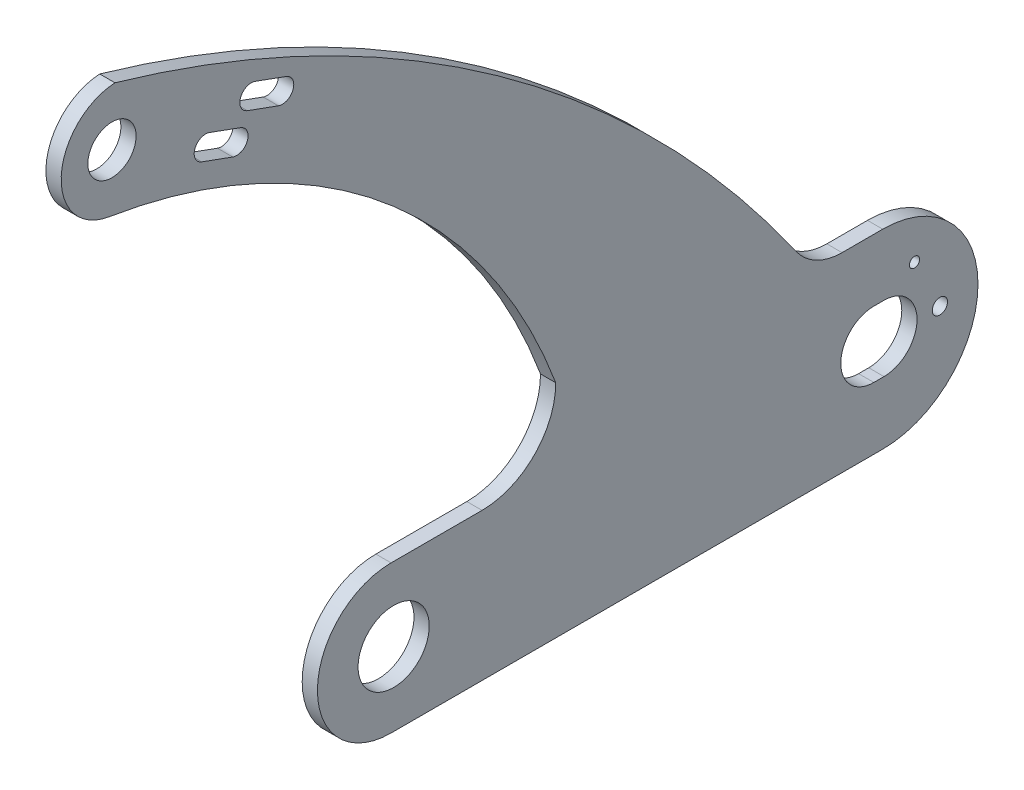
ISO-10303-21;
HEADER;
FILE_DESCRIPTION(('STEP AP214'),'2;1');
FILE_NAME('part.step','',(''),(''),'','','');
FILE_SCHEMA(('AUTOMOTIVE_DESIGN { 1 0 10303 214 1 1 1 1 }'));
ENDSEC;
DATA;
#1=APPLICATION_CONTEXT('core data for automotive mechanical design processes');
#2=APPLICATION_PROTOCOL_DEFINITION('international standard','automotive_design',2000,#1);
#3=PRODUCT_CONTEXT('',#1,'mechanical');
#4=PRODUCT('Part','Part','',(#3));
#5=PRODUCT_RELATED_PRODUCT_CATEGORY('part','',(#4));
#6=PRODUCT_DEFINITION_FORMATION('','',#4);
#7=PRODUCT_DEFINITION_CONTEXT('part definition',#1,'design');
#8=PRODUCT_DEFINITION('design','',#6,#7);
#9=PRODUCT_DEFINITION_SHAPE('','',#8);
#10=(LENGTH_UNIT() NAMED_UNIT(*) SI_UNIT(.MILLI.,.METRE.));
#11=(NAMED_UNIT(*) PLANE_ANGLE_UNIT() SI_UNIT($,.RADIAN.));
#12=(NAMED_UNIT(*) SI_UNIT($,.STERADIAN.) SOLID_ANGLE_UNIT());
#13=UNCERTAINTY_MEASURE_WITH_UNIT(LENGTH_MEASURE(1.E-05),#10,'distance_accuracy_value','');
#14=(GEOMETRIC_REPRESENTATION_CONTEXT(3) GLOBAL_UNCERTAINTY_ASSIGNED_CONTEXT((#13)) GLOBAL_UNIT_ASSIGNED_CONTEXT((#10,
#11,#12)) REPRESENTATION_CONTEXT('',''));
#15=CARTESIAN_POINT('',(0.,0.,0.));
#16=DIRECTION('',(0.,0.,1.));
#17=DIRECTION('',(1.,0.,0.));
#18=AXIS2_PLACEMENT_3D('',#15,#16,#17);
#19=CARTESIAN_POINT('',(3.,14.5,48.375));
#20=DIRECTION('',(-1.,0.,0.));
#21=DIRECTION('',(0.,0.,1.));
#22=AXIS2_PLACEMENT_3D('',#19,#20,#21);
#23=PLANE('',#22);
#24=CARTESIAN_POINT('',(3.,122.32435215854,75.8898695568463));
#25=DIRECTION('',(1.,0.,0.));
#26=DIRECTION('',(0.,0.,-1.));
#27=AXIS2_PLACEMENT_3D('',#24,#25,#26);
#28=CIRCLE('',#27,2.24999999999995);
#29=CARTESIAN_POINT('',(3.,124.438660555309,75.1203242343635));
#30=VERTEX_POINT('',#29);
#31=CARTESIAN_POINT('',(3.,120.210043761772,76.6594148793291));
#32=VERTEX_POINT('',#31);
#33=EDGE_CURVE('E240',#30,#32,#28,.T.);
#34=ORIENTED_EDGE('',*,*,#33,.F.);
#35=DIRECTION('',(0.,0.34202014332567,0.939692620785908));
#36=VECTOR('',#35,1.);
#37=CARTESIAN_POINT('',(3.,124.438660555309,75.1203242343635));
#38=LINE('',#37,#36);
#39=CARTESIAN_POINT('',(3.,122.215529623692,69.0123221992552));
#40=VERTEX_POINT('',#39);
#41=EDGE_CURVE('E251',#40,#30,#38,.T.);
#42=ORIENTED_EDGE('',*,*,#41,.F.);
#43=CARTESIAN_POINT('',(3.,120.101221226923,69.7818675217379));
#44=DIRECTION('',(1.,0.,0.));
#45=DIRECTION('',(0.,0.,-1.));
#46=AXIS2_PLACEMENT_3D('',#43,#44,#45);
#47=CIRCLE('',#46,2.24999999999998);
#48=CARTESIAN_POINT('',(3.,117.986912830155,70.5514128442207));
#49=VERTEX_POINT('',#48);
#50=EDGE_CURVE('E247',#49,#40,#47,.T.);
#51=ORIENTED_EDGE('',*,*,#50,.F.);
#52=DIRECTION('',(0.,-0.342020143325676,-0.939692620785906));
#53=VECTOR('',#52,1.);
#54=CARTESIAN_POINT('',(3.,120.210043761772,76.6594148793291));
#55=LINE('',#54,#53);
#56=EDGE_CURVE('E243',#32,#49,#55,.T.);
#57=ORIENTED_EDGE('',*,*,#56,.F.);
#58=EDGE_LOOP('',(#34,#42,#51,#57));
#59=FACE_BOUND('',#58,.T.);
#60=CARTESIAN_POINT('',(3.,126.865280687486,103.305641058254));
#61=DIRECTION('',(1.,0.,0.));
#62=DIRECTION('',(0.,0.,-1.));
#63=AXIS2_PLACEMENT_3D('',#60,#61,#62);
#64=CIRCLE('',#63,4.75000000000001);
#65=CARTESIAN_POINT('',(3.,126.865280687486,98.5556410582536));
#66=VERTEX_POINT('',#65);
#67=EDGE_CURVE('E326',#66,#66,#64,.T.);
#68=ORIENTED_EDGE('',*,*,#67,.F.);
#69=EDGE_LOOP('',(#68));
#70=FACE_BOUND('',#69,.T.);
#71=CARTESIAN_POINT('',(3.,14.5,47.875));
#72=DIRECTION('',(1.,0.,0.));
#73=DIRECTION('',(0.,0.,-1.));
#74=AXIS2_PLACEMENT_3D('',#71,#72,#73);
#75=CIRCLE('',#74,7.);
#76=CARTESIAN_POINT('',(3.,14.5,40.875));
#77=VERTEX_POINT('',#76);
#78=EDGE_CURVE('E334',#77,#77,#75,.T.);
#79=ORIENTED_EDGE('',*,*,#78,.F.);
#80=EDGE_LOOP('',(#79));
#81=FACE_BOUND('',#80,.T.);
#82=CARTESIAN_POINT('',(3.,28.75,-54.625));
#83=DIRECTION('',(1.,0.,0.));
#84=DIRECTION('',(0.,0.,-1.));
#85=AXIS2_PLACEMENT_3D('',#82,#83,#84);
#86=CIRCLE('',#85,0.999999999999998);
#87=CARTESIAN_POINT('',(3.,28.75,-55.625));
#88=VERTEX_POINT('',#87);
#89=EDGE_CURVE('E342',#88,#88,#86,.T.);
#90=ORIENTED_EDGE('',*,*,#89,.F.);
#91=EDGE_LOOP('',(#90));
#92=FACE_BOUND('',#91,.T.);
#93=CARTESIAN_POINT('',(3.,18.75,-59.625));
#94=DIRECTION('',(1.,0.,0.));
#95=DIRECTION('',(0.,0.,-1.));
#96=AXIS2_PLACEMENT_3D('',#93,#94,#95);
#97=CIRCLE('',#96,1.5);
#98=CARTESIAN_POINT('',(3.,18.75,-61.125));
#99=VERTEX_POINT('',#98);
#100=EDGE_CURVE('E350',#99,#99,#97,.T.);
#101=ORIENTED_EDGE('',*,*,#100,.F.);
#102=EDGE_LOOP('',(#101));
#103=FACE_BOUND('',#102,.T.);
#104=CARTESIAN_POINT('',(3.,14.5,48.375));
#105=DIRECTION('',(1.,0.,0.));
#106=DIRECTION('',(0.,0.,1.));
#107=AXIS2_PLACEMENT_3D('',#104,#105,#106);
#108=CIRCLE('',#107,14.5);
#109=CARTESIAN_POINT('',(3.,29.,48.375));
#110=VERTEX_POINT('',#109);
#111=CARTESIAN_POINT('',(3.,0.,48.375));
#112=VERTEX_POINT('',#111);
#113=EDGE_CURVE('E358',#110,#112,#108,.T.);
#114=ORIENTED_EDGE('',*,*,#113,.T.);
#115=DIRECTION('',(0.,0.,-1.));
#116=VECTOR('',#115,1.);
#117=CARTESIAN_POINT('',(3.,0.,48.375));
#118=LINE('',#117,#116);
#119=CARTESIAN_POINT('',(3.,0.,-48.375));
#120=VERTEX_POINT('',#119);
#121=EDGE_CURVE('E362',#112,#120,#118,.T.);
#122=ORIENTED_EDGE('',*,*,#121,.T.);
#123=CARTESIAN_POINT('',(3.,18.75,-48.375));
#124=DIRECTION('',(1.,0.,0.));
#125=DIRECTION('',(0.,0.,1.));
#126=AXIS2_PLACEMENT_3D('',#123,#124,#125);
#127=CIRCLE('',#126,18.75);
#128=CARTESIAN_POINT('',(3.,37.5,-48.375));
#129=VERTEX_POINT('',#128);
#130=EDGE_CURVE('E366',#120,#129,#127,.T.);
#131=ORIENTED_EDGE('',*,*,#130,.T.);
#132=DIRECTION('',(0.,0.,1.));
#133=VECTOR('',#132,1.);
#134=CARTESIAN_POINT('',(3.,37.5,-48.375));
#135=LINE('',#134,#133);
#136=CARTESIAN_POINT('',(3.,37.5,-40.375));
#137=VERTEX_POINT('',#136);
#138=EDGE_CURVE('E369',#129,#137,#135,.T.);
#139=ORIENTED_EDGE('',*,*,#138,.T.);
#140=CARTESIAN_POINT('',(3.,48.5,-40.375));
#141=DIRECTION('',(-1.,0.,0.));
#142=DIRECTION('',(0.,0.,1.));
#143=AXIS2_PLACEMENT_3D('',#140,#141,#142);
#144=CIRCLE('',#143,11.);
#145=CARTESIAN_POINT('',(3.,42.1906592001385,-31.3643275128211));
#146=VERTEX_POINT('',#145);
#147=EDGE_CURVE('E372',#137,#146,#144,.T.);
#148=ORIENTED_EDGE('',*,*,#147,.T.);
#149=CARTESIAN_POINT('',(3.,-99.7246797185502,171.311780890037));
#150=DIRECTION('',(1.,0.,0.));
#151=DIRECTION('',(0.,0.,-1.));
#152=AXIS2_PLACEMENT_3D('',#149,#150,#151);
#153=CIRCLE('',#152,247.42184288727);
#154=CARTESIAN_POINT('',(3.,138.,102.722095146145));
#155=VERTEX_POINT('',#154);
#156=EDGE_CURVE('E375',#146,#155,#153,.T.);
#157=ORIENTED_EDGE('',*,*,#156,.T.);
#158=CARTESIAN_POINT('',(3.,126.8016336227,102.091182715297));
#159=DIRECTION('',(1.,0.,0.));
#160=DIRECTION('',(0.,0.,-1.));
#161=AXIS2_PLACEMENT_3D('',#158,#159,#160);
#162=CIRCLE('',#161,11.2161250000004);
#163=CARTESIAN_POINT('',(3.,115.730561374973,103.889186970363));
#164=VERTEX_POINT('',#163);
#165=EDGE_CURVE('E378',#155,#164,#162,.T.);
#166=ORIENTED_EDGE('',*,*,#165,.T.);
#167=CARTESIAN_POINT('',(3.,4.03485944329796,122.029195711299));
#168=DIRECTION('',(-1.,0.,0.));
#169=DIRECTION('',(0.,0.,1.));
#170=AXIS2_PLACEMENT_3D('',#167,#168,#169);
#171=CIRCLE('',#170,113.159134616393);
#172=CARTESIAN_POINT('',(3.,43.5,15.975));
#173=VERTEX_POINT('',#172);
#174=EDGE_CURVE('E381',#164,#173,#171,.T.);
#175=ORIENTED_EDGE('',*,*,#174,.T.);
#176=CARTESIAN_POINT('',(3.,43.5,30.475));
#177=DIRECTION('',(-1.,0.,0.));
#178=DIRECTION('',(0.,0.,1.));
#179=AXIS2_PLACEMENT_3D('',#176,#177,#178);
#180=CIRCLE('',#179,14.5);
#181=CARTESIAN_POINT('',(3.,29.,30.475));
#182=VERTEX_POINT('',#181);
#183=EDGE_CURVE('E384',#173,#182,#180,.T.);
#184=ORIENTED_EDGE('',*,*,#183,.T.);
#185=DIRECTION('',(0.,0.,1.));
#186=VECTOR('',#185,1.);
#187=CARTESIAN_POINT('',(3.,29.,48.375));
#188=LINE('',#187,#186);
#189=EDGE_CURVE('E387',#182,#110,#188,.T.);
#190=ORIENTED_EDGE('',*,*,#189,.T.);
#191=EDGE_LOOP('',(#114,#122,#131,#139,#148,#157,#166,#175,#184,#190));
#192=FACE_BOUND('',#191,.T.);
#193=CARTESIAN_POINT('',(3.,118.095735365004,84.8817253112062));
#194=DIRECTION('',(1.,0.,0.));
#195=DIRECTION('',(0.,0.,-1.));
#196=AXIS2_PLACEMENT_3D('',#193,#194,#195);
#197=CIRCLE('',#196,2.25000000000001);
#198=CARTESIAN_POINT('',(3.,120.210043761772,84.1121799887234));
#199=VERTEX_POINT('',#198);
#200=CARTESIAN_POINT('',(3.,115.981426968236,85.6512706336889));
#201=VERTEX_POINT('',#200);
#202=EDGE_CURVE('E283',#199,#201,#197,.T.);
#203=ORIENTED_EDGE('',*,*,#202,.F.);
#204=DIRECTION('',(0.,0.342020143325671,0.939692620785908));
#205=VECTOR('',#204,1.);
#206=CARTESIAN_POINT('',(3.,120.210043761772,84.1121799887234));
#207=LINE('',#206,#205);
#208=CARTESIAN_POINT('',(3.,117.986912830155,78.0041779536146));
#209=VERTEX_POINT('',#208);
#210=EDGE_CURVE('E294',#209,#199,#207,.T.);
#211=ORIENTED_EDGE('',*,*,#210,.F.);
#212=CARTESIAN_POINT('',(3.,115.872604433387,78.7737232760973));
#213=DIRECTION('',(1.,0.,0.));
#214=DIRECTION('',(0.,0.,-1.));
#215=AXIS2_PLACEMENT_3D('',#212,#213,#214);
#216=CIRCLE('',#215,2.25000000000001);
#217=CARTESIAN_POINT('',(3.,113.758296036619,79.5432685985799));
#218=VERTEX_POINT('',#217);
#219=EDGE_CURVE('E290',#218,#209,#216,.T.);
#220=ORIENTED_EDGE('',*,*,#219,.F.);
#221=DIRECTION('',(0.,-0.342020143325671,-0.939692620785908));
#222=VECTOR('',#221,1.);
#223=CARTESIAN_POINT('',(3.,115.981426968236,85.6512706336889));
#224=LINE('',#223,#222);
#225=EDGE_CURVE('E286',#201,#218,#224,.T.);
#226=ORIENTED_EDGE('',*,*,#225,.F.);
#227=EDGE_LOOP('',(#203,#211,#220,#226));
#228=FACE_BOUND('',#227,.T.);
#229=CARTESIAN_POINT('',(3.,18.75,-46.625));
#230=DIRECTION('',(1.,0.,0.));
#231=DIRECTION('',(0.,0.,-1.));
#232=AXIS2_PLACEMENT_3D('',#229,#230,#231);
#233=CIRCLE('',#232,6.5);
#234=CARTESIAN_POINT('',(3.,25.25,-46.625));
#235=VERTEX_POINT('',#234);
#236=CARTESIAN_POINT('',(3.,12.25,-46.625));
#237=VERTEX_POINT('',#236);
#238=EDGE_CURVE('E192',#235,#237,#233,.T.);
#239=ORIENTED_EDGE('',*,*,#238,.F.);
#240=DIRECTION('',(0.,0.,1.));
#241=VECTOR('',#240,1.);
#242=CARTESIAN_POINT('',(3.,25.25,-46.625));
#243=LINE('',#242,#241);
#244=CARTESIAN_POINT('',(3.,25.25,-48.625));
#245=VERTEX_POINT('',#244);
#246=EDGE_CURVE('E218',#245,#235,#243,.T.);
#247=ORIENTED_EDGE('',*,*,#246,.F.);
#248=CARTESIAN_POINT('',(3.,18.75,-48.625));
#249=DIRECTION('',(1.,0.,0.));
#250=DIRECTION('',(0.,0.,-1.));
#251=AXIS2_PLACEMENT_3D('',#248,#249,#250);
#252=CIRCLE('',#251,6.5);
#253=CARTESIAN_POINT('',(3.,12.25,-48.625));
#254=VERTEX_POINT('',#253);
#255=EDGE_CURVE('E214',#254,#245,#252,.T.);
#256=ORIENTED_EDGE('',*,*,#255,.F.);
#257=DIRECTION('',(0.,0.,-1.));
#258=VECTOR('',#257,1.);
#259=CARTESIAN_POINT('',(3.,12.25,-46.625));
#260=LINE('',#259,#258);
#261=EDGE_CURVE('E201',#237,#254,#260,.T.);
#262=ORIENTED_EDGE('',*,*,#261,.F.);
#263=EDGE_LOOP('',(#239,#247,#256,#262));
#264=FACE_BOUND('',#263,.T.);
#265=ADVANCED_FACE('F42',(#59,#70,#81,#92,#103,#192,#228,#264),#23,.F.);
#266=CARTESIAN_POINT('',(0.,14.5,48.375));
#267=DIRECTION('',(-1.,0.,0.));
#268=DIRECTION('',(0.,0.,1.));
#269=AXIS2_PLACEMENT_3D('',#266,#267,#268);
#270=PLANE('',#269);
#271=CARTESIAN_POINT('',(0.,14.5,47.875));
#272=DIRECTION('',(1.,0.,0.));
#273=DIRECTION('',(0.,0.,-1.));
#274=AXIS2_PLACEMENT_3D('',#271,#272,#273);
#275=CIRCLE('',#274,7.);
#276=CARTESIAN_POINT('',(0.,14.5,40.875));
#277=VERTEX_POINT('',#276);
#278=EDGE_CURVE('E330',#277,#277,#275,.T.);
#279=ORIENTED_EDGE('',*,*,#278,.T.);
#280=EDGE_LOOP('',(#279));
#281=FACE_BOUND('',#280,.T.);
#282=CARTESIAN_POINT('',(0.,18.75,-59.625));
#283=DIRECTION('',(1.,0.,0.));
#284=DIRECTION('',(0.,0.,-1.));
#285=AXIS2_PLACEMENT_3D('',#282,#283,#284);
#286=CIRCLE('',#285,1.5);
#287=CARTESIAN_POINT('',(0.,18.75,-61.125));
#288=VERTEX_POINT('',#287);
#289=EDGE_CURVE('E346',#288,#288,#286,.T.);
#290=ORIENTED_EDGE('',*,*,#289,.T.);
#291=EDGE_LOOP('',(#290));
#292=FACE_BOUND('',#291,.T.);
#293=CARTESIAN_POINT('',(0.,14.5,48.375));
#294=DIRECTION('',(1.,0.,0.));
#295=DIRECTION('',(0.,0.,1.));
#296=AXIS2_PLACEMENT_3D('',#293,#294,#295);
#297=CIRCLE('',#296,14.5);
#298=CARTESIAN_POINT('',(0.,29.,48.375));
#299=VERTEX_POINT('',#298);
#300=CARTESIAN_POINT('',(0.,0.,48.375));
#301=VERTEX_POINT('',#300);
#302=EDGE_CURVE('E354',#299,#301,#297,.T.);
#303=ORIENTED_EDGE('',*,*,#302,.F.);
#304=DIRECTION('',(0.,0.,1.));
#305=VECTOR('',#304,1.);
#306=CARTESIAN_POINT('',(0.,29.,48.375));
#307=LINE('',#306,#305);
#308=CARTESIAN_POINT('',(0.,29.,30.475));
#309=VERTEX_POINT('',#308);
#310=EDGE_CURVE('E363',#309,#299,#307,.T.);
#311=ORIENTED_EDGE('',*,*,#310,.F.);
#312=CARTESIAN_POINT('',(0.,43.5,30.475));
#313=DIRECTION('',(-1.,0.,0.));
#314=DIRECTION('',(0.,0.,1.));
#315=AXIS2_PLACEMENT_3D('',#312,#313,#314);
#316=CIRCLE('',#315,14.5);
#317=CARTESIAN_POINT('',(0.,43.5,15.975));
#318=VERTEX_POINT('',#317);
#319=EDGE_CURVE('E415',#318,#309,#316,.T.);
#320=ORIENTED_EDGE('',*,*,#319,.F.);
#321=CARTESIAN_POINT('',(0.,4.03485944329796,122.029195711299));
#322=DIRECTION('',(-1.,0.,0.));
#323=DIRECTION('',(0.,0.,1.));
#324=AXIS2_PLACEMENT_3D('',#321,#322,#323);
#325=CIRCLE('',#324,113.159134616393);
#326=CARTESIAN_POINT('',(0.,115.730561374973,103.889186970363));
#327=VERTEX_POINT('',#326);
#328=EDGE_CURVE('E412',#327,#318,#325,.T.);
#329=ORIENTED_EDGE('',*,*,#328,.F.);
#330=CARTESIAN_POINT('',(0.,126.8016336227,102.091182715297));
#331=DIRECTION('',(1.,0.,0.));
#332=DIRECTION('',(0.,0.,-1.));
#333=AXIS2_PLACEMENT_3D('',#330,#331,#332);
#334=CIRCLE('',#333,11.2161250000004);
#335=CARTESIAN_POINT('',(0.,138.,102.722095146145));
#336=VERTEX_POINT('',#335);
#337=EDGE_CURVE('E409',#336,#327,#334,.T.);
#338=ORIENTED_EDGE('',*,*,#337,.F.);
#339=CARTESIAN_POINT('',(0.,-99.7246797185502,171.311780890037));
#340=DIRECTION('',(1.,0.,0.));
#341=DIRECTION('',(0.,0.,-1.));
#342=AXIS2_PLACEMENT_3D('',#339,#340,#341);
#343=CIRCLE('',#342,247.42184288727);
#344=CARTESIAN_POINT('',(0.,42.1906592001385,-31.3643275128211));
#345=VERTEX_POINT('',#344);
#346=EDGE_CURVE('E406',#345,#336,#343,.T.);
#347=ORIENTED_EDGE('',*,*,#346,.F.);
#348=CARTESIAN_POINT('',(0.,48.5,-40.375));
#349=DIRECTION('',(-1.,0.,0.));
#350=DIRECTION('',(0.,0.,1.));
#351=AXIS2_PLACEMENT_3D('',#348,#349,#350);
#352=CIRCLE('',#351,11.);
#353=CARTESIAN_POINT('',(0.,37.5,-40.375));
#354=VERTEX_POINT('',#353);
#355=EDGE_CURVE('E403',#354,#345,#352,.T.);
#356=ORIENTED_EDGE('',*,*,#355,.F.);
#357=DIRECTION('',(0.,0.,1.));
#358=VECTOR('',#357,1.);
#359=CARTESIAN_POINT('',(0.,37.5,-48.375));
#360=LINE('',#359,#358);
#361=CARTESIAN_POINT('',(0.,37.5,-48.375));
#362=VERTEX_POINT('',#361);
#363=EDGE_CURVE('E400',#362,#354,#360,.T.);
#364=ORIENTED_EDGE('',*,*,#363,.F.);
#365=CARTESIAN_POINT('',(0.,18.75,-48.375));
#366=DIRECTION('',(1.,0.,0.));
#367=DIRECTION('',(0.,0.,1.));
#368=AXIS2_PLACEMENT_3D('',#365,#366,#367);
#369=CIRCLE('',#368,18.75);
#370=CARTESIAN_POINT('',(0.,0.,-48.375));
#371=VERTEX_POINT('',#370);
#372=EDGE_CURVE('E397',#371,#362,#369,.T.);
#373=ORIENTED_EDGE('',*,*,#372,.F.);
#374=DIRECTION('',(0.,0.,-1.));
#375=VECTOR('',#374,1.);
#376=CARTESIAN_POINT('',(0.,0.,48.375));
#377=LINE('',#376,#375);
#378=EDGE_CURVE('E394',#301,#371,#377,.T.);
#379=ORIENTED_EDGE('',*,*,#378,.F.);
#380=EDGE_LOOP('',(#303,#311,#320,#329,#338,#347,#356,#364,#373,#379));
#381=FACE_BOUND('',#380,.T.);
#382=CARTESIAN_POINT('',(0.,28.75,-54.625));
#383=DIRECTION('',(1.,0.,0.));
#384=DIRECTION('',(0.,0.,-1.));
#385=AXIS2_PLACEMENT_3D('',#382,#383,#384);
#386=CIRCLE('',#385,0.999999999999998);
#387=CARTESIAN_POINT('',(0.,28.75,-55.625));
#388=VERTEX_POINT('',#387);
#389=EDGE_CURVE('E338',#388,#388,#386,.T.);
#390=ORIENTED_EDGE('',*,*,#389,.T.);
#391=EDGE_LOOP('',(#390));
#392=FACE_BOUND('',#391,.T.);
#393=CARTESIAN_POINT('',(0.,126.865280687486,103.305641058254));
#394=DIRECTION('',(1.,0.,0.));
#395=DIRECTION('',(0.,0.,-1.));
#396=AXIS2_PLACEMENT_3D('',#393,#394,#395);
#397=CIRCLE('',#396,4.75000000000001);
#398=CARTESIAN_POINT('',(0.,126.865280687486,98.5556410582536));
#399=VERTEX_POINT('',#398);
#400=EDGE_CURVE('E325',#399,#399,#397,.T.);
#401=ORIENTED_EDGE('',*,*,#400,.T.);
#402=EDGE_LOOP('',(#401));
#403=FACE_BOUND('',#402,.T.);
#404=DIRECTION('',(0.,0.342020143325671,0.939692620785908));
#405=VECTOR('',#404,1.);
#406=CARTESIAN_POINT('',(0.,120.210043761772,84.1121799887234));
#407=LINE('',#406,#405);
#408=CARTESIAN_POINT('',(0.,117.986912830155,78.0041779536146));
#409=VERTEX_POINT('',#408);
#410=CARTESIAN_POINT('',(0.,120.210043761772,84.1121799887234));
#411=VERTEX_POINT('',#410);
#412=EDGE_CURVE('E287',#409,#411,#407,.T.);
#413=ORIENTED_EDGE('',*,*,#412,.T.);
#414=CARTESIAN_POINT('',(0.,118.095735365004,84.8817253112062));
#415=DIRECTION('',(1.,0.,0.));
#416=DIRECTION('',(0.,0.,-1.));
#417=AXIS2_PLACEMENT_3D('',#414,#415,#416);
#418=CIRCLE('',#417,2.25000000000001);
#419=CARTESIAN_POINT('',(0.,115.981426968236,85.6512706336889));
#420=VERTEX_POINT('',#419);
#421=EDGE_CURVE('E282',#411,#420,#418,.T.);
#422=ORIENTED_EDGE('',*,*,#421,.T.);
#423=DIRECTION('',(0.,-0.342020143325671,-0.939692620785908));
#424=VECTOR('',#423,1.);
#425=CARTESIAN_POINT('',(0.,115.981426968236,85.6512706336889));
#426=LINE('',#425,#424);
#427=CARTESIAN_POINT('',(0.,113.758296036619,79.5432685985799));
#428=VERTEX_POINT('',#427);
#429=EDGE_CURVE('E301',#420,#428,#426,.T.);
#430=ORIENTED_EDGE('',*,*,#429,.T.);
#431=CARTESIAN_POINT('',(0.,115.872604433387,78.7737232760973));
#432=DIRECTION('',(1.,0.,0.));
#433=DIRECTION('',(0.,0.,-1.));
#434=AXIS2_PLACEMENT_3D('',#431,#432,#433);
#435=CIRCLE('',#434,2.25000000000001);
#436=EDGE_CURVE('E305',#428,#409,#435,.T.);
#437=ORIENTED_EDGE('',*,*,#436,.T.);
#438=EDGE_LOOP('',(#413,#422,#430,#437));
#439=FACE_BOUND('',#438,.T.);
#440=DIRECTION('',(0.,0.34202014332567,0.939692620785908));
#441=VECTOR('',#440,1.);
#442=CARTESIAN_POINT('',(0.,124.438660555309,75.1203242343635));
#443=LINE('',#442,#441);
#444=CARTESIAN_POINT('',(0.,122.215529623692,69.0123221992552));
#445=VERTEX_POINT('',#444);
#446=CARTESIAN_POINT('',(0.,124.438660555309,75.1203242343635));
#447=VERTEX_POINT('',#446);
#448=EDGE_CURVE('E244',#445,#447,#443,.T.);
#449=ORIENTED_EDGE('',*,*,#448,.T.);
#450=CARTESIAN_POINT('',(0.,122.32435215854,75.8898695568463));
#451=DIRECTION('',(1.,0.,0.));
#452=DIRECTION('',(0.,0.,-1.));
#453=AXIS2_PLACEMENT_3D('',#450,#451,#452);
#454=CIRCLE('',#453,2.24999999999995);
#455=CARTESIAN_POINT('',(0.,120.210043761772,76.6594148793291));
#456=VERTEX_POINT('',#455);
#457=EDGE_CURVE('E210',#447,#456,#454,.T.);
#458=ORIENTED_EDGE('',*,*,#457,.T.);
#459=DIRECTION('',(0.,-0.342020143325676,-0.939692620785906));
#460=VECTOR('',#459,1.);
#461=CARTESIAN_POINT('',(0.,120.210043761772,76.6594148793291));
#462=LINE('',#461,#460);
#463=CARTESIAN_POINT('',(0.,117.986912830155,70.5514128442207));
#464=VERTEX_POINT('',#463);
#465=EDGE_CURVE('E258',#456,#464,#462,.T.);
#466=ORIENTED_EDGE('',*,*,#465,.T.);
#467=CARTESIAN_POINT('',(0.,120.101221226923,69.7818675217379));
#468=DIRECTION('',(1.,0.,0.));
#469=DIRECTION('',(0.,0.,-1.));
#470=AXIS2_PLACEMENT_3D('',#467,#468,#469);
#471=CIRCLE('',#470,2.24999999999998);
#472=EDGE_CURVE('E262',#464,#445,#471,.T.);
#473=ORIENTED_EDGE('',*,*,#472,.T.);
#474=EDGE_LOOP('',(#449,#458,#466,#473));
#475=FACE_BOUND('',#474,.T.);
#476=DIRECTION('',(0.,0.,1.));
#477=VECTOR('',#476,1.);
#478=CARTESIAN_POINT('',(0.,25.25,-46.625));
#479=LINE('',#478,#477);
#480=CARTESIAN_POINT('',(0.,25.25,-48.625));
#481=VERTEX_POINT('',#480);
#482=CARTESIAN_POINT('',(0.,25.25,-46.625));
#483=VERTEX_POINT('',#482);
#484=EDGE_CURVE('E202',#481,#483,#479,.T.);
#485=ORIENTED_EDGE('',*,*,#484,.T.);
#486=CARTESIAN_POINT('',(0.,18.75,-46.625));
#487=DIRECTION('',(1.,0.,0.));
#488=DIRECTION('',(0.,0.,-1.));
#489=AXIS2_PLACEMENT_3D('',#486,#487,#488);
#490=CIRCLE('',#489,6.5);
#491=CARTESIAN_POINT('',(0.,12.25,-46.625));
#492=VERTEX_POINT('',#491);
#493=EDGE_CURVE('E66',#483,#492,#490,.T.);
#494=ORIENTED_EDGE('',*,*,#493,.T.);
#495=DIRECTION('',(0.,0.,-1.));
#496=VECTOR('',#495,1.);
#497=CARTESIAN_POINT('',(0.,12.25,-46.625));
#498=LINE('',#497,#496);
#499=CARTESIAN_POINT('',(0.,12.25,-48.625));
#500=VERTEX_POINT('',#499);
#501=EDGE_CURVE('E208',#492,#500,#498,.T.);
#502=ORIENTED_EDGE('',*,*,#501,.T.);
#503=CARTESIAN_POINT('',(0.,18.75,-48.625));
#504=DIRECTION('',(1.,0.,0.));
#505=DIRECTION('',(0.,0.,-1.));
#506=AXIS2_PLACEMENT_3D('',#503,#504,#505);
#507=CIRCLE('',#506,6.5);
#508=EDGE_CURVE('E227',#500,#481,#507,.T.);
#509=ORIENTED_EDGE('',*,*,#508,.T.);
#510=EDGE_LOOP('',(#485,#494,#502,#509));
#511=FACE_BOUND('',#510,.T.);
#512=ADVANCED_FACE('F462',(#281,#292,#381,#392,#403,#439,#475,#511),#270,.T.);
#513=CARTESIAN_POINT('',(3.,14.5,48.375));
#514=DIRECTION('',(-1.,0.,0.));
#515=DIRECTION('',(0.,0.,1.));
#516=AXIS2_PLACEMENT_3D('',#513,#514,#515);
#517=CYLINDRICAL_SURFACE('',#516,14.5);
#518=ORIENTED_EDGE('',*,*,#302,.T.);
#519=DIRECTION('',(-1.,0.,0.));
#520=VECTOR('',#519,1.);
#521=CARTESIAN_POINT('',(3.,0.,48.375));
#522=LINE('',#521,#520);
#523=EDGE_CURVE('E11',#112,#301,#522,.T.);
#524=ORIENTED_EDGE('',*,*,#523,.F.);
#525=ORIENTED_EDGE('',*,*,#113,.F.);
#526=DIRECTION('',(-1.,0.,0.));
#527=VECTOR('',#526,1.);
#528=CARTESIAN_POINT('',(3.,29.,48.375));
#529=LINE('',#528,#527);
#530=EDGE_CURVE('E390',#110,#299,#529,.T.);
#531=ORIENTED_EDGE('',*,*,#530,.T.);
#532=EDGE_LOOP('',(#518,#524,#525,#531));
#533=FACE_BOUND('',#532,.T.);
#534=ADVANCED_FACE('F44',(#533),#517,.T.);
#535=CARTESIAN_POINT('',(3.,0.,48.375));
#536=DIRECTION('',(0.,1.,0.));
#537=DIRECTION('',(0.,0.,1.));
#538=AXIS2_PLACEMENT_3D('',#535,#536,#537);
#539=PLANE('',#538);
#540=ORIENTED_EDGE('',*,*,#378,.T.);
#541=DIRECTION('',(-1.,0.,0.));
#542=VECTOR('',#541,1.);
#543=CARTESIAN_POINT('',(3.,0.,-48.375));
#544=LINE('',#543,#542);
#545=EDGE_CURVE('E51',#120,#371,#544,.T.);
#546=ORIENTED_EDGE('',*,*,#545,.F.);
#547=ORIENTED_EDGE('',*,*,#121,.F.);
#548=ORIENTED_EDGE('',*,*,#523,.T.);
#549=EDGE_LOOP('',(#540,#546,#547,#548));
#550=FACE_BOUND('',#549,.T.);
#551=ADVANCED_FACE('F480',(#550),#539,.F.);
#552=CARTESIAN_POINT('',(3.,18.75,-48.375));
#553=DIRECTION('',(-1.,0.,0.));
#554=DIRECTION('',(0.,0.,1.));
#555=AXIS2_PLACEMENT_3D('',#552,#553,#554);
#556=CYLINDRICAL_SURFACE('',#555,18.75);
#557=ORIENTED_EDGE('',*,*,#372,.T.);
#558=DIRECTION('',(-1.,0.,0.));
#559=VECTOR('',#558,1.);
#560=CARTESIAN_POINT('',(3.,37.5,-48.375));
#561=LINE('',#560,#559);
#562=EDGE_CURVE('E447',#129,#362,#561,.T.);
#563=ORIENTED_EDGE('',*,*,#562,.F.);
#564=ORIENTED_EDGE('',*,*,#130,.F.);
#565=ORIENTED_EDGE('',*,*,#545,.T.);
#566=EDGE_LOOP('',(#557,#563,#564,#565));
#567=FACE_BOUND('',#566,.T.);
#568=ADVANCED_FACE('F456',(#567),#556,.T.);
#569=CARTESIAN_POINT('',(3.,37.5,-48.375));
#570=DIRECTION('',(0.,-1.,0.));
#571=DIRECTION('',(0.,0.,-1.));
#572=AXIS2_PLACEMENT_3D('',#569,#570,#571);
#573=PLANE('',#572);
#574=ORIENTED_EDGE('',*,*,#363,.T.);
#575=DIRECTION('',(-1.,0.,0.));
#576=VECTOR('',#575,1.);
#577=CARTESIAN_POINT('',(3.,37.5,-40.375));
#578=LINE('',#577,#576);
#579=EDGE_CURVE('E443',#137,#354,#578,.T.);
#580=ORIENTED_EDGE('',*,*,#579,.F.);
#581=ORIENTED_EDGE('',*,*,#138,.F.);
#582=ORIENTED_EDGE('',*,*,#562,.T.);
#583=EDGE_LOOP('',(#574,#580,#581,#582));
#584=FACE_BOUND('',#583,.T.);
#585=ADVANCED_FACE('F468',(#584),#573,.F.);
#586=CARTESIAN_POINT('',(3.,48.5,-40.375));
#587=DIRECTION('',(-1.,0.,0.));
#588=DIRECTION('',(0.,0.,1.));
#589=AXIS2_PLACEMENT_3D('',#586,#587,#588);
#590=CYLINDRICAL_SURFACE('',#589,11.);
#591=ORIENTED_EDGE('',*,*,#355,.T.);
#592=DIRECTION('',(-1.,0.,0.));
#593=VECTOR('',#592,1.);
#594=CARTESIAN_POINT('',(3.,42.1906592001385,-31.3643275128211));
#595=LINE('',#594,#593);
#596=EDGE_CURVE('E439',#146,#345,#595,.T.);
#597=ORIENTED_EDGE('',*,*,#596,.F.);
#598=ORIENTED_EDGE('',*,*,#147,.F.);
#599=ORIENTED_EDGE('',*,*,#579,.T.);
#600=EDGE_LOOP('',(#591,#597,#598,#599));
#601=FACE_BOUND('',#600,.T.);
#602=ADVANCED_FACE('F472',(#601),#590,.F.);
#603=CARTESIAN_POINT('',(3.,-99.7246797185502,171.311780890037));
#604=DIRECTION('',(-1.,0.,0.));
#605=DIRECTION('',(0.,0.,1.));
#606=AXIS2_PLACEMENT_3D('',#603,#604,#605);
#607=CYLINDRICAL_SURFACE('',#606,247.42184288727);
#608=ORIENTED_EDGE('',*,*,#346,.T.);
#609=DIRECTION('',(-1.,0.,0.));
#610=VECTOR('',#609,1.);
#611=CARTESIAN_POINT('',(3.,138.,102.722095146145));
#612=LINE('',#611,#610);
#613=EDGE_CURVE('E435',#155,#336,#612,.T.);
#614=ORIENTED_EDGE('',*,*,#613,.F.);
#615=ORIENTED_EDGE('',*,*,#156,.F.);
#616=ORIENTED_EDGE('',*,*,#596,.T.);
#617=EDGE_LOOP('',(#608,#614,#615,#616));
#618=FACE_BOUND('',#617,.T.);
#619=ADVANCED_FACE('F503',(#618),#607,.T.);
#620=CARTESIAN_POINT('',(3.,126.8016336227,102.091182715297));
#621=DIRECTION('',(-1.,0.,0.));
#622=DIRECTION('',(0.,0.,1.));
#623=AXIS2_PLACEMENT_3D('',#620,#621,#622);
#624=CYLINDRICAL_SURFACE('',#623,11.2161250000004);
#625=ORIENTED_EDGE('',*,*,#337,.T.);
#626=DIRECTION('',(-1.,0.,0.));
#627=VECTOR('',#626,1.);
#628=CARTESIAN_POINT('',(3.,115.730561374973,103.889186970363));
#629=LINE('',#628,#627);
#630=EDGE_CURVE('E431',#164,#327,#629,.T.);
#631=ORIENTED_EDGE('',*,*,#630,.F.);
#632=ORIENTED_EDGE('',*,*,#165,.F.);
#633=ORIENTED_EDGE('',*,*,#613,.T.);
#634=EDGE_LOOP('',(#625,#631,#632,#633));
#635=FACE_BOUND('',#634,.T.);
#636=ADVANCED_FACE('F500',(#635),#624,.T.);
#637=CARTESIAN_POINT('',(3.,4.03485944329796,122.029195711299));
#638=DIRECTION('',(-1.,0.,0.));
#639=DIRECTION('',(0.,0.,1.));
#640=AXIS2_PLACEMENT_3D('',#637,#638,#639);
#641=CYLINDRICAL_SURFACE('',#640,113.159134616393);
#642=ORIENTED_EDGE('',*,*,#328,.T.);
#643=DIRECTION('',(-1.,0.,0.));
#644=VECTOR('',#643,1.);
#645=CARTESIAN_POINT('',(3.,43.5,15.975));
#646=LINE('',#645,#644);
#647=EDGE_CURVE('E427',#173,#318,#646,.T.);
#648=ORIENTED_EDGE('',*,*,#647,.F.);
#649=ORIENTED_EDGE('',*,*,#174,.F.);
#650=ORIENTED_EDGE('',*,*,#630,.T.);
#651=EDGE_LOOP('',(#642,#648,#649,#650));
#652=FACE_BOUND('',#651,.T.);
#653=ADVANCED_FACE('F496',(#652),#641,.F.);
#654=CARTESIAN_POINT('',(3.,43.5,30.475));
#655=DIRECTION('',(-1.,0.,0.));
#656=DIRECTION('',(0.,0.,1.));
#657=AXIS2_PLACEMENT_3D('',#654,#655,#656);
#658=CYLINDRICAL_SURFACE('',#657,14.5);
#659=ORIENTED_EDGE('',*,*,#319,.T.);
#660=DIRECTION('',(-1.,0.,0.));
#661=VECTOR('',#660,1.);
#662=CARTESIAN_POINT('',(3.,29.,30.475));
#663=LINE('',#662,#661);
#664=EDGE_CURVE('E423',#182,#309,#663,.T.);
#665=ORIENTED_EDGE('',*,*,#664,.F.);
#666=ORIENTED_EDGE('',*,*,#183,.F.);
#667=ORIENTED_EDGE('',*,*,#647,.T.);
#668=EDGE_LOOP('',(#659,#665,#666,#667));
#669=FACE_BOUND('',#668,.T.);
#670=ADVANCED_FACE('F492',(#669),#658,.F.);
#671=CARTESIAN_POINT('',(3.,29.,48.375));
#672=DIRECTION('',(0.,-1.,0.));
#673=DIRECTION('',(0.,0.,-1.));
#674=AXIS2_PLACEMENT_3D('',#671,#672,#673);
#675=PLANE('',#674);
#676=ORIENTED_EDGE('',*,*,#310,.T.);
#677=ORIENTED_EDGE('',*,*,#530,.F.);
#678=ORIENTED_EDGE('',*,*,#189,.F.);
#679=ORIENTED_EDGE('',*,*,#664,.T.);
#680=EDGE_LOOP('',(#676,#677,#678,#679));
#681=FACE_BOUND('',#680,.T.);
#682=ADVANCED_FACE('F487',(#681),#675,.F.);
#683=CARTESIAN_POINT('',(3.,18.75,-59.625));
#684=DIRECTION('',(-1.,0.,0.));
#685=DIRECTION('',(0.,0.,1.));
#686=AXIS2_PLACEMENT_3D('',#683,#684,#685);
#687=CYLINDRICAL_SURFACE('',#686,1.5);
#688=ORIENTED_EDGE('',*,*,#100,.T.);
#689=EDGE_LOOP('',(#688));
#690=FACE_BOUND('',#689,.T.);
#691=ORIENTED_EDGE('',*,*,#289,.F.);
#692=EDGE_LOOP('',(#691));
#693=FACE_BOUND('',#692,.T.);
#694=ADVANCED_FACE('F523',(#690,#693),#687,.F.);
#695=CARTESIAN_POINT('',(3.,28.75,-54.625));
#696=DIRECTION('',(-1.,0.,0.));
#697=DIRECTION('',(0.,0.,1.));
#698=AXIS2_PLACEMENT_3D('',#695,#696,#697);
#699=CYLINDRICAL_SURFACE('',#698,0.999999999999998);
#700=ORIENTED_EDGE('',*,*,#89,.T.);
#701=EDGE_LOOP('',(#700));
#702=FACE_BOUND('',#701,.T.);
#703=ORIENTED_EDGE('',*,*,#389,.F.);
#704=EDGE_LOOP('',(#703));
#705=FACE_BOUND('',#704,.T.);
#706=ADVANCED_FACE('F549',(#702,#705),#699,.F.);
#707=CARTESIAN_POINT('',(3.,14.5,47.875));
#708=DIRECTION('',(-1.,0.,0.));
#709=DIRECTION('',(0.,0.,1.));
#710=AXIS2_PLACEMENT_3D('',#707,#708,#709);
#711=CYLINDRICAL_SURFACE('',#710,7.);
#712=ORIENTED_EDGE('',*,*,#78,.T.);
#713=EDGE_LOOP('',(#712));
#714=FACE_BOUND('',#713,.T.);
#715=ORIENTED_EDGE('',*,*,#278,.F.);
#716=EDGE_LOOP('',(#715));
#717=FACE_BOUND('',#716,.T.);
#718=ADVANCED_FACE('F556',(#714,#717),#711,.F.);
#719=CARTESIAN_POINT('',(3.,126.865280687486,103.305641058254));
#720=DIRECTION('',(-1.,0.,0.));
#721=DIRECTION('',(0.,0.,1.));
#722=AXIS2_PLACEMENT_3D('',#719,#720,#721);
#723=CYLINDRICAL_SURFACE('',#722,4.75000000000001);
#724=ORIENTED_EDGE('',*,*,#67,.T.);
#725=EDGE_LOOP('',(#724));
#726=FACE_BOUND('',#725,.T.);
#727=ORIENTED_EDGE('',*,*,#400,.F.);
#728=EDGE_LOOP('',(#727));
#729=FACE_BOUND('',#728,.T.);
#730=ADVANCED_FACE('F563',(#726,#729),#723,.F.);
#731=CARTESIAN_POINT('',(3.,118.095735365004,84.8817253112062));
#732=DIRECTION('',(-1.,0.,0.));
#733=DIRECTION('',(0.,0.,1.));
#734=AXIS2_PLACEMENT_3D('',#731,#732,#733);
#735=CYLINDRICAL_SURFACE('',#734,2.25000000000001);
#736=ORIENTED_EDGE('',*,*,#421,.F.);
#737=DIRECTION('',(-1.,0.,0.));
#738=VECTOR('',#737,1.);
#739=CARTESIAN_POINT('',(3.,120.210043761772,84.1121799887234));
#740=LINE('',#739,#738);
#741=EDGE_CURVE('E297',#199,#411,#740,.T.);
#742=ORIENTED_EDGE('',*,*,#741,.F.);
#743=ORIENTED_EDGE('',*,*,#202,.T.);
#744=DIRECTION('',(-1.,0.,0.));
#745=VECTOR('',#744,1.);
#746=CARTESIAN_POINT('',(3.,115.981426968236,85.6512706336889));
#747=LINE('',#746,#745);
#748=EDGE_CURVE('E321',#201,#420,#747,.T.);
#749=ORIENTED_EDGE('',*,*,#748,.T.);
#750=EDGE_LOOP('',(#736,#742,#743,#749));
#751=FACE_BOUND('',#750,.T.);
#752=ADVANCED_FACE('F571',(#751),#735,.F.);
#753=CARTESIAN_POINT('',(3.,115.981426968236,85.6512706336889));
#754=DIRECTION('',(0.,0.939692620785908,-0.342020143325671));
#755=DIRECTION('',(0.,0.342020143325671,0.939692620785908));
#756=AXIS2_PLACEMENT_3D('',#753,#754,#755);
#757=PLANE('',#756);
#758=ORIENTED_EDGE('',*,*,#429,.F.);
#759=ORIENTED_EDGE('',*,*,#748,.F.);
#760=ORIENTED_EDGE('',*,*,#225,.T.);
#761=DIRECTION('',(-1.,0.,0.));
#762=VECTOR('',#761,1.);
#763=CARTESIAN_POINT('',(3.,113.758296036619,79.5432685985799));
#764=LINE('',#763,#762);
#765=EDGE_CURVE('E318',#218,#428,#764,.T.);
#766=ORIENTED_EDGE('',*,*,#765,.T.);
#767=EDGE_LOOP('',(#758,#759,#760,#766));
#768=FACE_BOUND('',#767,.T.);
#769=ADVANCED_FACE('F579',(#768),#757,.T.);
#770=CARTESIAN_POINT('',(3.,115.872604433387,78.7737232760973));
#771=DIRECTION('',(-1.,0.,0.));
#772=DIRECTION('',(0.,0.,1.));
#773=AXIS2_PLACEMENT_3D('',#770,#771,#772);
#774=CYLINDRICAL_SURFACE('',#773,2.25000000000001);
#775=ORIENTED_EDGE('',*,*,#436,.F.);
#776=ORIENTED_EDGE('',*,*,#765,.F.);
#777=ORIENTED_EDGE('',*,*,#219,.T.);
#778=DIRECTION('',(-1.,0.,0.));
#779=VECTOR('',#778,1.);
#780=CARTESIAN_POINT('',(3.,117.986912830155,78.0041779536146));
#781=LINE('',#780,#779);
#782=EDGE_CURVE('E315',#209,#409,#781,.T.);
#783=ORIENTED_EDGE('',*,*,#782,.T.);
#784=EDGE_LOOP('',(#775,#776,#777,#783));
#785=FACE_BOUND('',#784,.T.);
#786=ADVANCED_FACE('F587',(#785),#774,.F.);
#787=CARTESIAN_POINT('',(3.,120.210043761772,84.1121799887234));
#788=DIRECTION('',(0.,-0.939692620785908,0.342020143325671));
#789=DIRECTION('',(0.,-0.342020143325671,-0.939692620785908));
#790=AXIS2_PLACEMENT_3D('',#787,#788,#789);
#791=PLANE('',#790);
#792=ORIENTED_EDGE('',*,*,#412,.F.);
#793=ORIENTED_EDGE('',*,*,#782,.F.);
#794=ORIENTED_EDGE('',*,*,#210,.T.);
#795=ORIENTED_EDGE('',*,*,#741,.T.);
#796=EDGE_LOOP('',(#792,#793,#794,#795));
#797=FACE_BOUND('',#796,.T.);
#798=ADVANCED_FACE('F595',(#797),#791,.T.);
#799=CARTESIAN_POINT('',(3.,122.32435215854,75.8898695568463));
#800=DIRECTION('',(-1.,0.,0.));
#801=DIRECTION('',(0.,0.,1.));
#802=AXIS2_PLACEMENT_3D('',#799,#800,#801);
#803=CYLINDRICAL_SURFACE('',#802,2.24999999999995);
#804=ORIENTED_EDGE('',*,*,#457,.F.);
#805=DIRECTION('',(-1.,0.,0.));
#806=VECTOR('',#805,1.);
#807=CARTESIAN_POINT('',(3.,124.438660555309,75.1203242343635));
#808=LINE('',#807,#806);
#809=EDGE_CURVE('E254',#30,#447,#808,.T.);
#810=ORIENTED_EDGE('',*,*,#809,.F.);
#811=ORIENTED_EDGE('',*,*,#33,.T.);
#812=DIRECTION('',(-1.,0.,0.));
#813=VECTOR('',#812,1.);
#814=CARTESIAN_POINT('',(3.,120.210043761772,76.6594148793291));
#815=LINE('',#814,#813);
#816=EDGE_CURVE('E278',#32,#456,#815,.T.);
#817=ORIENTED_EDGE('',*,*,#816,.T.);
#818=EDGE_LOOP('',(#804,#810,#811,#817));
#819=FACE_BOUND('',#818,.T.);
#820=ADVANCED_FACE('F603',(#819),#803,.F.);
#821=CARTESIAN_POINT('',(3.,120.210043761772,76.6594148793291));
#822=DIRECTION('',(0.,0.939692620785905,-0.342020143325676));
#823=DIRECTION('',(0.,0.342020143325676,0.939692620785906));
#824=AXIS2_PLACEMENT_3D('',#821,#822,#823);
#825=PLANE('',#824);
#826=ORIENTED_EDGE('',*,*,#465,.F.);
#827=ORIENTED_EDGE('',*,*,#816,.F.);
#828=ORIENTED_EDGE('',*,*,#56,.T.);
#829=DIRECTION('',(-1.,0.,0.));
#830=VECTOR('',#829,1.);
#831=CARTESIAN_POINT('',(3.,117.986912830155,70.5514128442207));
#832=LINE('',#831,#830);
#833=EDGE_CURVE('E275',#49,#464,#832,.T.);
#834=ORIENTED_EDGE('',*,*,#833,.T.);
#835=EDGE_LOOP('',(#826,#827,#828,#834));
#836=FACE_BOUND('',#835,.T.);
#837=ADVANCED_FACE('F611',(#836),#825,.T.);
#838=CARTESIAN_POINT('',(3.,120.101221226923,69.7818675217379));
#839=DIRECTION('',(-1.,0.,0.));
#840=DIRECTION('',(0.,0.,1.));
#841=AXIS2_PLACEMENT_3D('',#838,#839,#840);
#842=CYLINDRICAL_SURFACE('',#841,2.24999999999998);
#843=ORIENTED_EDGE('',*,*,#472,.F.);
#844=ORIENTED_EDGE('',*,*,#833,.F.);
#845=ORIENTED_EDGE('',*,*,#50,.T.);
#846=DIRECTION('',(-1.,0.,0.));
#847=VECTOR('',#846,1.);
#848=CARTESIAN_POINT('',(3.,122.215529623692,69.0123221992552));
#849=LINE('',#848,#847);
#850=EDGE_CURVE('E272',#40,#445,#849,.T.);
#851=ORIENTED_EDGE('',*,*,#850,.T.);
#852=EDGE_LOOP('',(#843,#844,#845,#851));
#853=FACE_BOUND('',#852,.T.);
#854=ADVANCED_FACE('F619',(#853),#842,.F.);
#855=CARTESIAN_POINT('',(3.,124.438660555309,75.1203242343635));
#856=DIRECTION('',(0.,-0.939692620785908,0.34202014332567));
#857=DIRECTION('',(0.,-0.34202014332567,-0.939692620785908));
#858=AXIS2_PLACEMENT_3D('',#855,#856,#857);
#859=PLANE('',#858);
#860=ORIENTED_EDGE('',*,*,#448,.F.);
#861=ORIENTED_EDGE('',*,*,#850,.F.);
#862=ORIENTED_EDGE('',*,*,#41,.T.);
#863=ORIENTED_EDGE('',*,*,#809,.T.);
#864=EDGE_LOOP('',(#860,#861,#862,#863));
#865=FACE_BOUND('',#864,.T.);
#866=ADVANCED_FACE('F627',(#865),#859,.T.);
#867=CARTESIAN_POINT('',(3.,18.75,-46.625));
#868=DIRECTION('',(-1.,0.,0.));
#869=DIRECTION('',(0.,0.,1.));
#870=AXIS2_PLACEMENT_3D('',#867,#868,#869);
#871=CYLINDRICAL_SURFACE('',#870,6.5);
#872=ORIENTED_EDGE('',*,*,#493,.F.);
#873=DIRECTION('',(-1.,0.,0.));
#874=VECTOR('',#873,1.);
#875=CARTESIAN_POINT('',(3.,25.25,-46.625));
#876=LINE('',#875,#874);
#877=EDGE_CURVE('E196',#235,#483,#876,.T.);
#878=ORIENTED_EDGE('',*,*,#877,.F.);
#879=ORIENTED_EDGE('',*,*,#238,.T.);
#880=DIRECTION('',(-1.,0.,0.));
#881=VECTOR('',#880,1.);
#882=CARTESIAN_POINT('',(3.,12.25,-46.625));
#883=LINE('',#882,#881);
#884=EDGE_CURVE('E195',#237,#492,#883,.T.);
#885=ORIENTED_EDGE('',*,*,#884,.T.);
#886=EDGE_LOOP('',(#872,#878,#879,#885));
#887=FACE_BOUND('',#886,.T.);
#888=ADVANCED_FACE('F194',(#887),#871,.F.);
#889=CARTESIAN_POINT('',(3.,12.25,-46.625));
#890=DIRECTION('',(0.,1.,0.));
#891=DIRECTION('',(0.,0.,1.));
#892=AXIS2_PLACEMENT_3D('',#889,#890,#891);
#893=PLANE('',#892);
#894=ORIENTED_EDGE('',*,*,#501,.F.);
#895=ORIENTED_EDGE('',*,*,#884,.F.);
#896=ORIENTED_EDGE('',*,*,#261,.T.);
#897=DIRECTION('',(-1.,0.,0.));
#898=VECTOR('',#897,1.);
#899=CARTESIAN_POINT('',(3.,12.25,-48.625));
#900=LINE('',#899,#898);
#901=EDGE_CURVE('E211',#254,#500,#900,.T.);
#902=ORIENTED_EDGE('',*,*,#901,.T.);
#903=EDGE_LOOP('',(#894,#895,#896,#902));
#904=FACE_BOUND('',#903,.T.);
#905=ADVANCED_FACE('F205',(#904),#893,.T.);
#906=CARTESIAN_POINT('',(3.,18.75,-48.625));
#907=DIRECTION('',(-1.,0.,0.));
#908=DIRECTION('',(0.,0.,1.));
#909=AXIS2_PLACEMENT_3D('',#906,#907,#908);
#910=CYLINDRICAL_SURFACE('',#909,6.5);
#911=ORIENTED_EDGE('',*,*,#508,.F.);
#912=ORIENTED_EDGE('',*,*,#901,.F.);
#913=ORIENTED_EDGE('',*,*,#255,.T.);
#914=DIRECTION('',(-1.,0.,0.));
#915=VECTOR('',#914,1.);
#916=CARTESIAN_POINT('',(3.,25.25,-48.625));
#917=LINE('',#916,#915);
#918=EDGE_CURVE('E58',#245,#481,#917,.T.);
#919=ORIENTED_EDGE('',*,*,#918,.T.);
#920=EDGE_LOOP('',(#911,#912,#913,#919));
#921=FACE_BOUND('',#920,.T.);
#922=ADVANCED_FACE('F648',(#921),#910,.F.);
#923=CARTESIAN_POINT('',(3.,25.25,-46.625));
#924=DIRECTION('',(0.,-1.,0.));
#925=DIRECTION('',(0.,0.,-1.));
#926=AXIS2_PLACEMENT_3D('',#923,#924,#925);
#927=PLANE('',#926);
#928=ORIENTED_EDGE('',*,*,#484,.F.);
#929=ORIENTED_EDGE('',*,*,#918,.F.);
#930=ORIENTED_EDGE('',*,*,#246,.T.);
#931=ORIENTED_EDGE('',*,*,#877,.T.);
#932=EDGE_LOOP('',(#928,#929,#930,#931));
#933=FACE_BOUND('',#932,.T.);
#934=ADVANCED_FACE('F655',(#933),#927,.T.);
#935=CLOSED_SHELL('',(#265,#512,#534,#551,#568,#585,#602,#619,#636,#653,#670,#682,#694,#706,
#718,#730,#752,#769,#786,#798,#820,#837,#854,#866,#888,#905,#922,#934));
#936=MANIFOLD_SOLID_BREP('B2',#935);
#937=ADVANCED_BREP_SHAPE_REPRESENTATION('',(#18,#936),#14);
#938=SHAPE_DEFINITION_REPRESENTATION(#9,#937);
ENDSEC;
END-ISO-10303-21;
